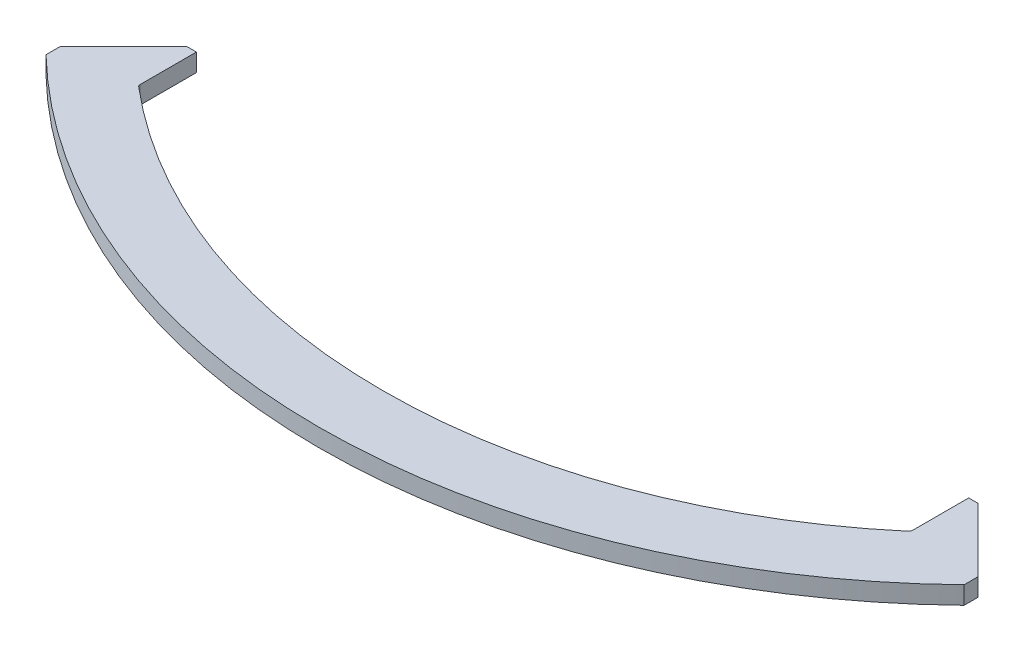
ISO-10303-21;
HEADER;
FILE_DESCRIPTION(('STEP AP214'),'2;1');
FILE_NAME('part.step','',(''),(''),'','','');
FILE_SCHEMA(('AUTOMOTIVE_DESIGN { 1 0 10303 214 1 1 1 1 }'));
ENDSEC;
DATA;
#1=APPLICATION_CONTEXT('core data for automotive mechanical design processes');
#2=APPLICATION_PROTOCOL_DEFINITION('international standard','automotive_design',2000,#1);
#3=PRODUCT_CONTEXT('',#1,'mechanical');
#4=PRODUCT('Part','Part','',(#3));
#5=PRODUCT_RELATED_PRODUCT_CATEGORY('part','',(#4));
#6=PRODUCT_DEFINITION_FORMATION('','',#4);
#7=PRODUCT_DEFINITION_CONTEXT('part definition',#1,'design');
#8=PRODUCT_DEFINITION('design','',#6,#7);
#9=PRODUCT_DEFINITION_SHAPE('','',#8);
#10=(LENGTH_UNIT() NAMED_UNIT(*) SI_UNIT(.MILLI.,.METRE.));
#11=(NAMED_UNIT(*) PLANE_ANGLE_UNIT() SI_UNIT($,.RADIAN.));
#12=(NAMED_UNIT(*) SI_UNIT($,.STERADIAN.) SOLID_ANGLE_UNIT());
#13=UNCERTAINTY_MEASURE_WITH_UNIT(LENGTH_MEASURE(1.E-05),#10,'distance_accuracy_value','');
#14=(GEOMETRIC_REPRESENTATION_CONTEXT(3) GLOBAL_UNCERTAINTY_ASSIGNED_CONTEXT((#13)) GLOBAL_UNIT_ASSIGNED_CONTEXT((#10,
#11,#12)) REPRESENTATION_CONTEXT('',''));
#15=CARTESIAN_POINT('',(0.,0.,0.));
#16=DIRECTION('',(0.,0.,1.));
#17=DIRECTION('',(1.,0.,0.));
#18=AXIS2_PLACEMENT_3D('',#15,#16,#17);
#19=CARTESIAN_POINT('',(469.9,18.25625,469.9));
#20=DIRECTION('',(-0.707106781186548,0.,0.707106781186548));
#21=DIRECTION('',(0.707106781186548,0.,0.707106781186548));
#22=AXIS2_PLACEMENT_3D('',#19,#20,#21);
#23=PLANE('',#22);
#24=DIRECTION('',(-0.707106781186548,0.,-0.707106781186548));
#25=VECTOR('',#24,1.);
#26=CARTESIAN_POINT('',(469.9,0.,469.9));
#27=LINE('',#26,#25);
#28=CARTESIAN_POINT('',(469.9,0.,469.9));
#29=VERTEX_POINT('',#28);
#30=CARTESIAN_POINT('',(404.8125,0.,404.8125));
#31=VERTEX_POINT('',#30);
#32=EDGE_CURVE('E144',#29,#31,#27,.T.);
#33=ORIENTED_EDGE('',*,*,#32,.T.);
#34=DIRECTION('',(0.,-1.,0.));
#35=VECTOR('',#34,1.);
#36=CARTESIAN_POINT('',(404.8125,18.25625,404.8125));
#37=LINE('',#36,#35);
#38=CARTESIAN_POINT('',(404.8125,18.25625,404.8125));
#39=VERTEX_POINT('',#38);
#40=EDGE_CURVE('E125',#39,#31,#37,.T.);
#41=ORIENTED_EDGE('',*,*,#40,.F.);
#42=DIRECTION('',(-0.707106781186548,0.,-0.707106781186548));
#43=VECTOR('',#42,1.);
#44=CARTESIAN_POINT('',(469.9,18.25625,469.9));
#45=LINE('',#44,#43);
#46=CARTESIAN_POINT('',(469.9,18.25625,469.9));
#47=VERTEX_POINT('',#46);
#48=EDGE_CURVE('E132',#47,#39,#45,.T.);
#49=ORIENTED_EDGE('',*,*,#48,.F.);
#50=DIRECTION('',(0.,-1.,0.));
#51=VECTOR('',#50,1.);
#52=CARTESIAN_POINT('',(469.9,18.25625,469.9));
#53=LINE('',#52,#51);
#54=EDGE_CURVE('E196',#47,#29,#53,.T.);
#55=ORIENTED_EDGE('',*,*,#54,.T.);
#56=EDGE_LOOP('',(#33,#41,#49,#55));
#57=FACE_BOUND('',#56,.T.);
#58=ADVANCED_FACE('F33',(#57),#23,.F.);
#59=CARTESIAN_POINT('',(404.8125,18.25625,404.8125));
#60=DIRECTION('',(0.,0.,1.));
#61=DIRECTION('',(1.,0.,0.));
#62=AXIS2_PLACEMENT_3D('',#59,#60,#61);
#63=PLANE('',#62);
#64=DIRECTION('',(-1.,0.,0.));
#65=VECTOR('',#64,1.);
#66=CARTESIAN_POINT('',(404.8125,0.,404.8125));
#67=LINE('',#66,#65);
#68=CARTESIAN_POINT('',(395.2875,0.,404.8125));
#69=VERTEX_POINT('',#68);
#70=EDGE_CURVE('E198',#31,#69,#67,.T.);
#71=ORIENTED_EDGE('',*,*,#70,.T.);
#72=DIRECTION('',(0.,-1.,0.));
#73=VECTOR('',#72,1.);
#74=CARTESIAN_POINT('',(395.2875,18.25625,404.8125));
#75=LINE('',#74,#73);
#76=CARTESIAN_POINT('',(395.2875,18.25625,404.8125));
#77=VERTEX_POINT('',#76);
#78=EDGE_CURVE('E128',#77,#69,#75,.T.);
#79=ORIENTED_EDGE('',*,*,#78,.F.);
#80=DIRECTION('',(-1.,0.,0.));
#81=VECTOR('',#80,1.);
#82=CARTESIAN_POINT('',(404.8125,18.25625,404.8125));
#83=LINE('',#82,#81);
#84=EDGE_CURVE('E121',#39,#77,#83,.T.);
#85=ORIENTED_EDGE('',*,*,#84,.F.);
#86=ORIENTED_EDGE('',*,*,#40,.T.);
#87=EDGE_LOOP('',(#71,#79,#85,#86));
#88=FACE_BOUND('',#87,.T.);
#89=ADVANCED_FACE('F123',(#88),#63,.F.);
#90=CARTESIAN_POINT('',(395.2875,18.25625,464.068909046652));
#91=DIRECTION('',(1.,0.,0.));
#92=DIRECTION('',(0.,0.,-1.));
#93=AXIS2_PLACEMENT_3D('',#90,#91,#92);
#94=PLANE('',#93);
#95=DIRECTION('',(0.,0.,1.));
#96=VECTOR('',#95,1.);
#97=CARTESIAN_POINT('',(395.2875,0.,464.068909046652));
#98=LINE('',#97,#96);
#99=CARTESIAN_POINT('',(395.2875,0.,462.506185222155));
#100=VERTEX_POINT('',#99);
#101=EDGE_CURVE('E174',#69,#100,#98,.T.);
#102=ORIENTED_EDGE('',*,*,#101,.T.);
#103=DIRECTION('',(0.,1.,0.));
#104=VECTOR('',#103,1.);
#105=CARTESIAN_POINT('',(395.2875,18.25625,462.506185222155));
#106=LINE('',#105,#104);
#107=CARTESIAN_POINT('',(395.2875,18.25625,462.506185222155));
#108=VERTEX_POINT('',#107);
#109=EDGE_CURVE('E155',#100,#108,#106,.T.);
#110=ORIENTED_EDGE('',*,*,#109,.T.);
#111=DIRECTION('',(0.,0.,1.));
#112=VECTOR('',#111,1.);
#113=CARTESIAN_POINT('',(395.2875,18.25625,464.068909046652));
#114=LINE('',#113,#112);
#115=EDGE_CURVE('E131',#77,#108,#114,.T.);
#116=ORIENTED_EDGE('',*,*,#115,.F.);
#117=ORIENTED_EDGE('',*,*,#78,.T.);
#118=EDGE_LOOP('',(#102,#110,#116,#117));
#119=FACE_BOUND('',#118,.T.);
#120=ADVANCED_FACE('F247',(#119),#94,.F.);
#121=CARTESIAN_POINT('',(0.,18.25625,0.));
#122=DIRECTION('',(0.,-1.,0.));
#123=DIRECTION('',(0.,0.,-1.));
#124=AXIS2_PLACEMENT_3D('',#121,#122,#123);
#125=CYLINDRICAL_SURFACE('',#124,609.6);
#126=CARTESIAN_POINT('',(0.,18.25625,0.));
#127=DIRECTION('',(0.,-1.,0.));
#128=DIRECTION('',(0.,0.,1.));
#129=AXIS2_PLACEMENT_3D('',#126,#127,#128);
#130=CIRCLE('',#129,609.6);
#131=CARTESIAN_POINT('',(394.09323333473,18.25625,465.083523079219));
#132=VERTEX_POINT('',#131);
#133=CARTESIAN_POINT('',(-394.09323333473,18.25625,465.083523079219));
#134=VERTEX_POINT('',#133);
#135=EDGE_CURVE('E183',#132,#134,#130,.T.);
#136=ORIENTED_EDGE('',*,*,#135,.F.);
#137=DIRECTION('',(0.,-1.,0.));
#138=VECTOR('',#137,1.);
#139=CARTESIAN_POINT('',(394.09323333473,18.25625,465.083523079219));
#140=LINE('',#139,#138);
#141=CARTESIAN_POINT('',(394.09323333473,0.,465.083523079219));
#142=VERTEX_POINT('',#141);
#143=EDGE_CURVE('E147',#132,#142,#140,.T.);
#144=ORIENTED_EDGE('',*,*,#143,.T.);
#145=CARTESIAN_POINT('',(0.,0.,0.));
#146=DIRECTION('',(0.,-1.,0.));
#147=DIRECTION('',(0.,0.,1.));
#148=AXIS2_PLACEMENT_3D('',#145,#146,#147);
#149=CIRCLE('',#148,609.6);
#150=CARTESIAN_POINT('',(-394.09323333473,0.,465.083523079219));
#151=VERTEX_POINT('',#150);
#152=EDGE_CURVE('E167',#142,#151,#149,.T.);
#153=ORIENTED_EDGE('',*,*,#152,.T.);
#154=DIRECTION('',(0.,-1.,0.));
#155=VECTOR('',#154,1.);
#156=CARTESIAN_POINT('',(-394.09323333473,18.25625,465.083523079219));
#157=LINE('',#156,#155);
#158=EDGE_CURVE('E145',#151,#134,#157,.F.);
#159=ORIENTED_EDGE('',*,*,#158,.T.);
#160=EDGE_LOOP('',(#136,#144,#153,#159));
#161=FACE_BOUND('',#160,.T.);
#162=ADVANCED_FACE('F172',(#161),#125,.F.);
#163=CARTESIAN_POINT('',(-395.2875,18.25625,464.068909046652));
#164=DIRECTION('',(-1.,0.,0.));
#165=DIRECTION('',(0.,0.,1.));
#166=AXIS2_PLACEMENT_3D('',#163,#164,#165);
#167=PLANE('',#166);
#168=DIRECTION('',(0.,0.,-1.));
#169=VECTOR('',#168,1.);
#170=CARTESIAN_POINT('',(-395.2875,18.25625,464.068909046652));
#171=LINE('',#170,#169);
#172=CARTESIAN_POINT('',(-395.2875,18.25625,462.506185222155));
#173=VERTEX_POINT('',#172);
#174=CARTESIAN_POINT('',(-395.2875,18.25625,404.8125));
#175=VERTEX_POINT('',#174);
#176=EDGE_CURVE('E180',#173,#175,#171,.T.);
#177=ORIENTED_EDGE('',*,*,#176,.F.);
#178=DIRECTION('',(0.,1.,0.));
#179=VECTOR('',#178,1.);
#180=CARTESIAN_POINT('',(-395.2875,0.,462.506185222155));
#181=LINE('',#180,#179);
#182=CARTESIAN_POINT('',(-395.2875,0.,462.506185222155));
#183=VERTEX_POINT('',#182);
#184=EDGE_CURVE('E157',#173,#183,#181,.F.);
#185=ORIENTED_EDGE('',*,*,#184,.T.);
#186=DIRECTION('',(0.,0.,-1.));
#187=VECTOR('',#186,1.);
#188=CARTESIAN_POINT('',(-395.2875,0.,464.068909046652));
#189=LINE('',#188,#187);
#190=CARTESIAN_POINT('',(-395.2875,0.,404.8125));
#191=VERTEX_POINT('',#190);
#192=EDGE_CURVE('E169',#183,#191,#189,.T.);
#193=ORIENTED_EDGE('',*,*,#192,.T.);
#194=DIRECTION('',(0.,-1.,0.));
#195=VECTOR('',#194,1.);
#196=CARTESIAN_POINT('',(-395.2875,18.25625,404.8125));
#197=LINE('',#196,#195);
#198=EDGE_CURVE('E149',#175,#191,#197,.T.);
#199=ORIENTED_EDGE('',*,*,#198,.F.);
#200=EDGE_LOOP('',(#177,#185,#193,#199));
#201=FACE_BOUND('',#200,.T.);
#202=ADVANCED_FACE('F177',(#201),#167,.F.);
#203=CARTESIAN_POINT('',(-404.8125,18.25625,404.8125));
#204=DIRECTION('',(0.,0.,1.));
#205=DIRECTION('',(1.,0.,0.));
#206=AXIS2_PLACEMENT_3D('',#203,#204,#205);
#207=PLANE('',#206);
#208=DIRECTION('',(-1.,0.,0.));
#209=VECTOR('',#208,1.);
#210=CARTESIAN_POINT('',(-404.8125,0.,404.8125));
#211=LINE('',#210,#209);
#212=CARTESIAN_POINT('',(-404.8125,0.,404.8125));
#213=VERTEX_POINT('',#212);
#214=EDGE_CURVE('E203',#191,#213,#211,.T.);
#215=ORIENTED_EDGE('',*,*,#214,.T.);
#216=DIRECTION('',(0.,-1.,0.));
#217=VECTOR('',#216,1.);
#218=CARTESIAN_POINT('',(-404.8125,18.25625,404.8125));
#219=LINE('',#218,#217);
#220=CARTESIAN_POINT('',(-404.8125,18.25625,404.8125));
#221=VERTEX_POINT('',#220);
#222=EDGE_CURVE('E222',#221,#213,#219,.T.);
#223=ORIENTED_EDGE('',*,*,#222,.F.);
#224=DIRECTION('',(-1.,0.,0.));
#225=VECTOR('',#224,1.);
#226=CARTESIAN_POINT('',(-404.8125,18.25625,404.8125));
#227=LINE('',#226,#225);
#228=EDGE_CURVE('E182',#175,#221,#227,.T.);
#229=ORIENTED_EDGE('',*,*,#228,.F.);
#230=ORIENTED_EDGE('',*,*,#198,.T.);
#231=EDGE_LOOP('',(#215,#223,#229,#230));
#232=FACE_BOUND('',#231,.T.);
#233=ADVANCED_FACE('F225',(#232),#207,.F.);
#234=CARTESIAN_POINT('',(-469.9,18.25625,469.9));
#235=DIRECTION('',(0.707106781186548,0.,0.707106781186548));
#236=DIRECTION('',(0.707106781186548,0.,-0.707106781186548));
#237=AXIS2_PLACEMENT_3D('',#234,#235,#236);
#238=PLANE('',#237);
#239=DIRECTION('',(-0.707106781186548,0.,0.707106781186548));
#240=VECTOR('',#239,1.);
#241=CARTESIAN_POINT('',(-469.9,0.,469.9));
#242=LINE('',#241,#240);
#243=CARTESIAN_POINT('',(-469.9,0.,469.9));
#244=VERTEX_POINT('',#243);
#245=EDGE_CURVE('E205',#213,#244,#242,.T.);
#246=ORIENTED_EDGE('',*,*,#245,.T.);
#247=DIRECTION('',(0.,-1.,0.));
#248=VECTOR('',#247,1.);
#249=CARTESIAN_POINT('',(-469.9,18.25625,469.9));
#250=LINE('',#249,#248);
#251=CARTESIAN_POINT('',(-469.9,18.25625,469.9));
#252=VERTEX_POINT('',#251);
#253=EDGE_CURVE('E219',#252,#244,#250,.T.);
#254=ORIENTED_EDGE('',*,*,#253,.F.);
#255=DIRECTION('',(-0.707106781186548,0.,0.707106781186548));
#256=VECTOR('',#255,1.);
#257=CARTESIAN_POINT('',(-469.9,18.25625,469.9));
#258=LINE('',#257,#256);
#259=EDGE_CURVE('E185',#221,#252,#258,.T.);
#260=ORIENTED_EDGE('',*,*,#259,.F.);
#261=ORIENTED_EDGE('',*,*,#222,.T.);
#262=EDGE_LOOP('',(#246,#254,#260,#261));
#263=FACE_BOUND('',#262,.T.);
#264=ADVANCED_FACE('F232',(#263),#238,.F.);
#265=CARTESIAN_POINT('',(-469.9,18.25625,484.145858865125));
#266=DIRECTION('',(1.,0.,0.));
#267=DIRECTION('',(0.,0.,-1.));
#268=AXIS2_PLACEMENT_3D('',#265,#266,#267);
#269=PLANE('',#268);
#270=DIRECTION('',(0.,0.,1.));
#271=VECTOR('',#270,1.);
#272=CARTESIAN_POINT('',(-469.9,0.,484.145858865125));
#273=LINE('',#272,#271);
#274=CARTESIAN_POINT('',(-469.9,0.,484.145858865125));
#275=VERTEX_POINT('',#274);
#276=EDGE_CURVE('E207',#244,#275,#273,.T.);
#277=ORIENTED_EDGE('',*,*,#276,.T.);
#278=DIRECTION('',(0.,-1.,0.));
#279=VECTOR('',#278,1.);
#280=CARTESIAN_POINT('',(-469.9,18.25625,484.145858865125));
#281=LINE('',#280,#279);
#282=CARTESIAN_POINT('',(-469.9,18.25625,484.145858865125));
#283=VERTEX_POINT('',#282);
#284=EDGE_CURVE('E216',#283,#275,#281,.T.);
#285=ORIENTED_EDGE('',*,*,#284,.F.);
#286=DIRECTION('',(0.,0.,1.));
#287=VECTOR('',#286,1.);
#288=CARTESIAN_POINT('',(-469.9,18.25625,484.145858865125));
#289=LINE('',#288,#287);
#290=EDGE_CURVE('E191',#252,#283,#289,.T.);
#291=ORIENTED_EDGE('',*,*,#290,.F.);
#292=ORIENTED_EDGE('',*,*,#253,.T.);
#293=EDGE_LOOP('',(#277,#285,#291,#292));
#294=FACE_BOUND('',#293,.T.);
#295=ADVANCED_FACE('F236',(#294),#269,.F.);
#296=CARTESIAN_POINT('',(0.,18.25625,0.));
#297=DIRECTION('',(0.,-1.,0.));
#298=DIRECTION('',(0.,0.,-1.));
#299=AXIS2_PLACEMENT_3D('',#296,#297,#298);
#300=CYLINDRICAL_SURFACE('',#299,674.6875);
#301=CARTESIAN_POINT('',(0.,0.,0.));
#302=DIRECTION('',(0.,1.,0.));
#303=DIRECTION('',(0.,0.,1.));
#304=AXIS2_PLACEMENT_3D('',#301,#302,#303);
#305=CIRCLE('',#304,674.6875);
#306=CARTESIAN_POINT('',(469.9,0.,484.145858865125));
#307=VERTEX_POINT('',#306);
#308=EDGE_CURVE('E209',#275,#307,#305,.T.);
#309=ORIENTED_EDGE('',*,*,#308,.T.);
#310=DIRECTION('',(0.,-1.,0.));
#311=VECTOR('',#310,1.);
#312=CARTESIAN_POINT('',(469.9,18.25625,484.145858865125));
#313=LINE('',#312,#311);
#314=CARTESIAN_POINT('',(469.9,18.25625,484.145858865125));
#315=VERTEX_POINT('',#314);
#316=EDGE_CURVE('E213',#315,#307,#313,.T.);
#317=ORIENTED_EDGE('',*,*,#316,.F.);
#318=CARTESIAN_POINT('',(0.,18.25625,0.));
#319=DIRECTION('',(0.,1.,0.));
#320=DIRECTION('',(0.,0.,1.));
#321=AXIS2_PLACEMENT_3D('',#318,#319,#320);
#322=CIRCLE('',#321,674.6875);
#323=EDGE_CURVE('E193',#283,#315,#322,.T.);
#324=ORIENTED_EDGE('',*,*,#323,.F.);
#325=ORIENTED_EDGE('',*,*,#284,.T.);
#326=EDGE_LOOP('',(#309,#317,#324,#325));
#327=FACE_BOUND('',#326,.T.);
#328=ADVANCED_FACE('F241',(#327),#300,.T.);
#329=CARTESIAN_POINT('',(469.9,18.25625,484.145858865125));
#330=DIRECTION('',(-1.,0.,0.));
#331=DIRECTION('',(0.,0.,1.));
#332=AXIS2_PLACEMENT_3D('',#329,#330,#331);
#333=PLANE('',#332);
#334=DIRECTION('',(0.,0.,-1.));
#335=VECTOR('',#334,1.);
#336=CARTESIAN_POINT('',(469.9,0.,484.145858865125));
#337=LINE('',#336,#335);
#338=EDGE_CURVE('E141',#307,#29,#337,.T.);
#339=ORIENTED_EDGE('',*,*,#338,.T.);
#340=ORIENTED_EDGE('',*,*,#54,.F.);
#341=DIRECTION('',(0.,0.,-1.));
#342=VECTOR('',#341,1.);
#343=CARTESIAN_POINT('',(469.9,18.25625,484.145858865125));
#344=LINE('',#343,#342);
#345=EDGE_CURVE('E137',#315,#47,#344,.T.);
#346=ORIENTED_EDGE('',*,*,#345,.F.);
#347=ORIENTED_EDGE('',*,*,#316,.T.);
#348=EDGE_LOOP('',(#339,#340,#346,#347));
#349=FACE_BOUND('',#348,.T.);
#350=ADVANCED_FACE('F244',(#349),#333,.F.);
#351=CARTESIAN_POINT('',(0.,18.25625,0.));
#352=DIRECTION('',(0.,1.,0.));
#353=DIRECTION('',(0.,0.,1.));
#354=AXIS2_PLACEMENT_3D('',#351,#352,#353);
#355=PLANE('',#354);
#356=ORIENTED_EDGE('',*,*,#48,.T.);
#357=ORIENTED_EDGE('',*,*,#84,.T.);
#358=ORIENTED_EDGE('',*,*,#115,.T.);
#359=CARTESIAN_POINT('',(391.9093,18.25625,462.506185222155));
#360=DIRECTION('',(0.,1.,0.));
#361=DIRECTION('',(0.,0.,1.));
#362=AXIS2_PLACEMENT_3D('',#359,#360,#361);
#363=CIRCLE('',#362,3.3782);
#364=EDGE_CURVE('E161',#108,#132,#363,.F.);
#365=ORIENTED_EDGE('',*,*,#364,.T.);
#366=ORIENTED_EDGE('',*,*,#135,.T.);
#367=CARTESIAN_POINT('',(-391.9093,18.25625,462.506185222155));
#368=DIRECTION('',(0.,1.,0.));
#369=DIRECTION('',(0.,0.,1.));
#370=AXIS2_PLACEMENT_3D('',#367,#368,#369);
#371=CIRCLE('',#370,3.3782);
#372=EDGE_CURVE('E11',#134,#173,#371,.F.);
#373=ORIENTED_EDGE('',*,*,#372,.T.);
#374=ORIENTED_EDGE('',*,*,#176,.T.);
#375=ORIENTED_EDGE('',*,*,#228,.T.);
#376=ORIENTED_EDGE('',*,*,#259,.T.);
#377=ORIENTED_EDGE('',*,*,#290,.T.);
#378=ORIENTED_EDGE('',*,*,#323,.T.);
#379=ORIENTED_EDGE('',*,*,#345,.T.);
#380=EDGE_LOOP('',(#356,#357,#358,#365,#366,#373,#374,#375,#376,#377,#378,#379));
#381=FACE_BOUND('',#380,.T.);
#382=ADVANCED_FACE('F135',(#381),#355,.T.);
#383=CARTESIAN_POINT('',(0.,0.,0.));
#384=DIRECTION('',(0.,1.,0.));
#385=DIRECTION('',(0.,0.,1.));
#386=AXIS2_PLACEMENT_3D('',#383,#384,#385);
#387=PLANE('',#386);
#388=ORIENTED_EDGE('',*,*,#32,.F.);
#389=ORIENTED_EDGE('',*,*,#338,.F.);
#390=ORIENTED_EDGE('',*,*,#308,.F.);
#391=ORIENTED_EDGE('',*,*,#276,.F.);
#392=ORIENTED_EDGE('',*,*,#245,.F.);
#393=ORIENTED_EDGE('',*,*,#214,.F.);
#394=ORIENTED_EDGE('',*,*,#192,.F.);
#395=CARTESIAN_POINT('',(-391.9093,0.,462.506185222155));
#396=DIRECTION('',(0.,1.,0.));
#397=DIRECTION('',(0.,0.,1.));
#398=AXIS2_PLACEMENT_3D('',#395,#396,#397);
#399=CIRCLE('',#398,3.3782);
#400=EDGE_CURVE('E41',#183,#151,#399,.T.);
#401=ORIENTED_EDGE('',*,*,#400,.T.);
#402=ORIENTED_EDGE('',*,*,#152,.F.);
#403=CARTESIAN_POINT('',(391.9093,0.,462.506185222155));
#404=DIRECTION('',(0.,1.,0.));
#405=DIRECTION('',(0.,0.,1.));
#406=AXIS2_PLACEMENT_3D('',#403,#404,#405);
#407=CIRCLE('',#406,3.3782);
#408=EDGE_CURVE('E159',#142,#100,#407,.T.);
#409=ORIENTED_EDGE('',*,*,#408,.T.);
#410=ORIENTED_EDGE('',*,*,#101,.F.);
#411=ORIENTED_EDGE('',*,*,#70,.F.);
#412=EDGE_LOOP('',(#388,#389,#390,#391,#392,#393,#394,#401,#402,#409,#410,#411));
#413=FACE_BOUND('',#412,.T.);
#414=ADVANCED_FACE('F166',(#413),#387,.F.);
#415=CARTESIAN_POINT('',(391.9093,18.25625,462.506185222155));
#416=DIRECTION('',(0.,-1.,0.));
#417=DIRECTION('',(0.,0.,-1.));
#418=AXIS2_PLACEMENT_3D('',#415,#416,#417);
#419=CYLINDRICAL_SURFACE('',#418,3.3782);
#420=ORIENTED_EDGE('',*,*,#364,.F.);
#421=ORIENTED_EDGE('',*,*,#109,.F.);
#422=ORIENTED_EDGE('',*,*,#408,.F.);
#423=ORIENTED_EDGE('',*,*,#143,.F.);
#424=EDGE_LOOP('',(#420,#421,#422,#423));
#425=FACE_BOUND('',#424,.T.);
#426=ADVANCED_FACE('F251',(#425),#419,.F.);
#427=CARTESIAN_POINT('',(-391.9093,18.25625,462.506185222155));
#428=DIRECTION('',(0.,-1.,0.));
#429=DIRECTION('',(0.,0.,-1.));
#430=AXIS2_PLACEMENT_3D('',#427,#428,#429);
#431=CYLINDRICAL_SURFACE('',#430,3.3782);
#432=ORIENTED_EDGE('',*,*,#372,.F.);
#433=ORIENTED_EDGE('',*,*,#158,.F.);
#434=ORIENTED_EDGE('',*,*,#400,.F.);
#435=ORIENTED_EDGE('',*,*,#184,.F.);
#436=EDGE_LOOP('',(#432,#433,#434,#435));
#437=FACE_BOUND('',#436,.T.);
#438=ADVANCED_FACE('F35',(#437),#431,.F.);
#439=CLOSED_SHELL('',(#58,#89,#120,#162,#202,#233,#264,#295,#328,#350,#382,#414,#426,#438));
#440=MANIFOLD_SOLID_BREP('B2',#439);
#441=ADVANCED_BREP_SHAPE_REPRESENTATION('',(#18,#440),#14);
#442=SHAPE_DEFINITION_REPRESENTATION(#9,#441);
ENDSEC;
END-ISO-10303-21;
